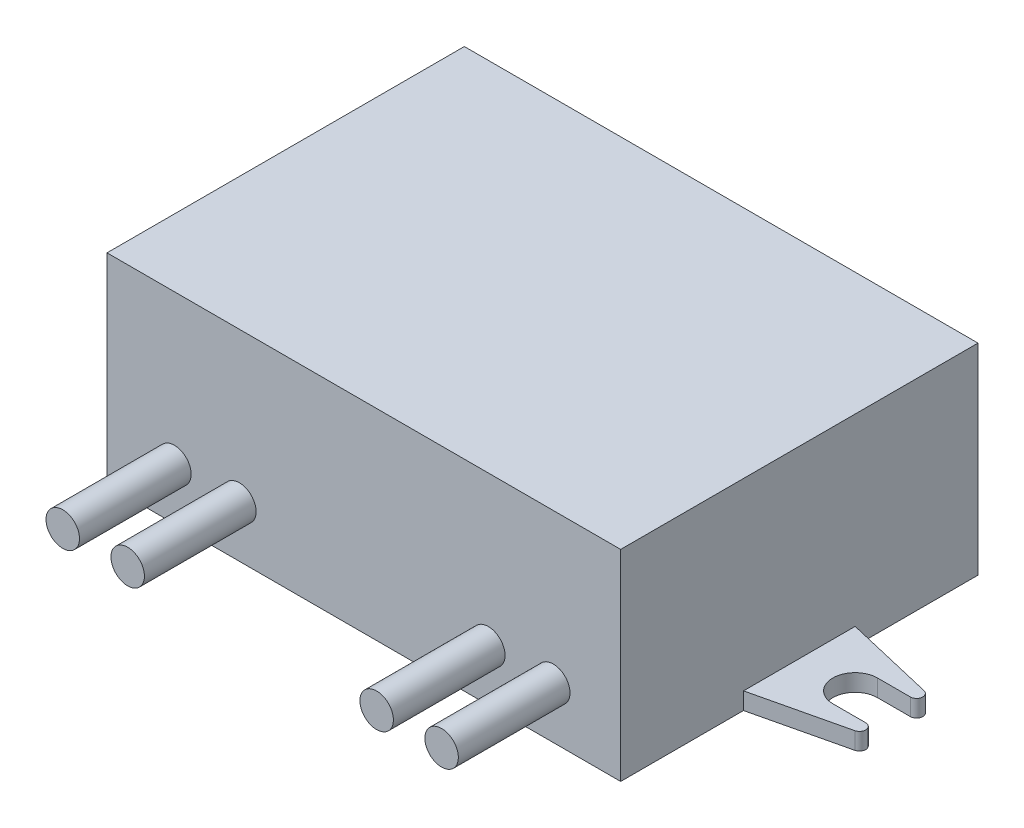
ISO-10303-21;
HEADER;
FILE_DESCRIPTION(('STEP AP214'),'2;1');
FILE_NAME('part.step','',(''),(''),'','','');
FILE_SCHEMA(('AUTOMOTIVE_DESIGN { 1 0 10303 214 1 1 1 1 }'));
ENDSEC;
DATA;
#1=APPLICATION_CONTEXT('core data for automotive mechanical design processes');
#2=APPLICATION_PROTOCOL_DEFINITION('international standard','automotive_design',2000,#1);
#3=PRODUCT_CONTEXT('',#1,'mechanical');
#4=PRODUCT('Part','Part','',(#3));
#5=PRODUCT_RELATED_PRODUCT_CATEGORY('part','',(#4));
#6=PRODUCT_DEFINITION_FORMATION('','',#4);
#7=PRODUCT_DEFINITION_CONTEXT('part definition',#1,'design');
#8=PRODUCT_DEFINITION('design','',#6,#7);
#9=PRODUCT_DEFINITION_SHAPE('','',#8);
#10=(LENGTH_UNIT() NAMED_UNIT(*) SI_UNIT(.MILLI.,.METRE.));
#11=(NAMED_UNIT(*) PLANE_ANGLE_UNIT() SI_UNIT($,.RADIAN.));
#12=(NAMED_UNIT(*) SI_UNIT($,.STERADIAN.) SOLID_ANGLE_UNIT());
#13=UNCERTAINTY_MEASURE_WITH_UNIT(LENGTH_MEASURE(1.E-05),#10,'distance_accuracy_value','');
#14=(GEOMETRIC_REPRESENTATION_CONTEXT(3) GLOBAL_UNCERTAINTY_ASSIGNED_CONTEXT((#13)) GLOBAL_UNIT_ASSIGNED_CONTEXT((#10,
#11,#12)) REPRESENTATION_CONTEXT('',''));
#15=CARTESIAN_POINT('',(0.,0.,0.));
#16=DIRECTION('',(0.,0.,1.));
#17=DIRECTION('',(1.,0.,0.));
#18=AXIS2_PLACEMENT_3D('',#15,#16,#17);
#19=CARTESIAN_POINT('',(30.9419688504284,0.,2.55803114957162));
#20=DIRECTION('',(0.,1.,0.));
#21=DIRECTION('',(-1.,0.,0.));
#22=AXIS2_PLACEMENT_3D('',#19,#20,#21);
#23=CYLINDRICAL_SURFACE('',#22,0.558031149571622);
#24=DIRECTION('',(0.,-1.,0.));
#25=VECTOR('',#24,1.);
#26=CARTESIAN_POINT('',(31.0697799331244,0.,3.10122825102956));
#27=LINE('',#26,#25);
#28=CARTESIAN_POINT('',(31.0697799331244,0.,3.10122825102956));
#29=VERTEX_POINT('',#28);
#30=CARTESIAN_POINT('',(31.0697799331244,1.52802024933194,3.10122825102956));
#31=VERTEX_POINT('',#30);
#32=EDGE_CURVE('E291',#29,#31,#27,.F.);
#33=ORIENTED_EDGE('',*,*,#32,.F.);
#34=CARTESIAN_POINT('',(30.9419688504284,0.,2.55803114957162));
#35=DIRECTION('',(0.,1.,0.));
#36=DIRECTION('',(0.,0.,1.));
#37=AXIS2_PLACEMENT_3D('',#34,#35,#36);
#38=CIRCLE('',#37,0.558031149571622);
#39=CARTESIAN_POINT('',(30.9419688504284,0.,2.));
#40=VERTEX_POINT('',#39);
#41=EDGE_CURVE('E73',#40,#29,#38,.F.);
#42=ORIENTED_EDGE('',*,*,#41,.F.);
#43=DIRECTION('',(0.,-1.,0.));
#44=VECTOR('',#43,1.);
#45=CARTESIAN_POINT('',(30.9419688504284,0.,2.));
#46=LINE('',#45,#44);
#47=CARTESIAN_POINT('',(30.9419688504284,1.52802024933194,2.));
#48=VERTEX_POINT('',#47);
#49=EDGE_CURVE('E295',#48,#40,#46,.T.);
#50=ORIENTED_EDGE('',*,*,#49,.F.);
#51=CARTESIAN_POINT('',(30.9419688504284,1.52802024933196,2.55803114957162));
#52=DIRECTION('',(0.,1.,0.));
#53=DIRECTION('',(-1.,0.,0.));
#54=AXIS2_PLACEMENT_3D('',#51,#52,#53);
#55=CIRCLE('',#54,0.558031149571622);
#56=EDGE_CURVE('E81',#31,#48,#55,.T.);
#57=ORIENTED_EDGE('',*,*,#56,.F.);
#58=EDGE_LOOP('',(#33,#42,#50,#57));
#59=FACE_BOUND('',#58,.T.);
#60=ADVANCED_FACE('F57',(#59),#23,.T.);
#61=CARTESIAN_POINT('',(30.9419688504284,0.,-2.55803114957162));
#62=DIRECTION('',(0.,1.,0.));
#63=DIRECTION('',(-1.,0.,0.));
#64=AXIS2_PLACEMENT_3D('',#61,#62,#63);
#65=CYLINDRICAL_SURFACE('',#64,0.558031149571622);
#66=DIRECTION('',(0.,1.,0.));
#67=VECTOR('',#66,1.);
#68=CARTESIAN_POINT('',(30.9419688504284,0.,-2.));
#69=LINE('',#68,#67);
#70=CARTESIAN_POINT('',(30.9419688504284,0.,-2.));
#71=VERTEX_POINT('',#70);
#72=CARTESIAN_POINT('',(30.9419688504284,1.52802024933194,-2.));
#73=VERTEX_POINT('',#72);
#74=EDGE_CURVE('E277',#71,#73,#69,.T.);
#75=ORIENTED_EDGE('',*,*,#74,.F.);
#76=CARTESIAN_POINT('',(30.9419688504284,0.,-2.55803114957162));
#77=DIRECTION('',(0.,1.,0.));
#78=DIRECTION('',(0.,0.,1.));
#79=AXIS2_PLACEMENT_3D('',#76,#77,#78);
#80=CIRCLE('',#79,0.558031149571622);
#81=CARTESIAN_POINT('',(31.0697799331244,0.,-3.10122825102956));
#82=VERTEX_POINT('',#81);
#83=EDGE_CURVE('E285',#82,#71,#80,.F.);
#84=ORIENTED_EDGE('',*,*,#83,.F.);
#85=DIRECTION('',(0.,1.,0.));
#86=VECTOR('',#85,1.);
#87=CARTESIAN_POINT('',(31.0697799331244,0.,-3.10122825102956));
#88=LINE('',#87,#86);
#89=CARTESIAN_POINT('',(31.0697799331244,1.52802024933194,-3.10122825102956));
#90=VERTEX_POINT('',#89);
#91=EDGE_CURVE('E281',#90,#82,#88,.F.);
#92=ORIENTED_EDGE('',*,*,#91,.F.);
#93=CARTESIAN_POINT('',(30.9419688504284,1.52802024933196,-2.55803114957162));
#94=DIRECTION('',(0.,1.,0.));
#95=DIRECTION('',(-1.,0.,0.));
#96=AXIS2_PLACEMENT_3D('',#93,#94,#95);
#97=CIRCLE('',#96,0.558031149571622);
#98=EDGE_CURVE('E288',#73,#90,#97,.T.);
#99=ORIENTED_EDGE('',*,*,#98,.F.);
#100=EDGE_LOOP('',(#75,#84,#92,#99));
#101=FACE_BOUND('',#100,.T.);
#102=ADVANCED_FACE('F494',(#101),#65,.T.);
#103=CARTESIAN_POINT('',(0.,0.,0.));
#104=DIRECTION('',(0.,1.,0.));
#105=DIRECTION('',(0.,0.,1.));
#106=AXIS2_PLACEMENT_3D('',#103,#104,#105);
#107=PLANE('',#106);
#108=DIRECTION('',(1.,0.,0.));
#109=VECTOR('',#108,1.);
#110=CARTESIAN_POINT('',(0.,0.,2.00000000000001));
#111=LINE('',#110,#109);
#112=CARTESIAN_POINT('',(28.,0.,2.));
#113=VERTEX_POINT('',#112);
#114=EDGE_CURVE('E351',#113,#40,#111,.T.);
#115=ORIENTED_EDGE('',*,*,#114,.T.);
#116=ORIENTED_EDGE('',*,*,#41,.T.);
#117=DIRECTION('',(-0.973417168333576,0.,0.229039333725547));
#118=VECTOR('',#117,1.);
#119=CARTESIAN_POINT('',(2.32131147540983,0.,9.8655737704918));
#120=LINE('',#119,#118);
#121=CARTESIAN_POINT('',(23.,0.,5.));
#122=VERTEX_POINT('',#121);
#123=EDGE_CURVE('E335',#29,#122,#120,.T.);
#124=ORIENTED_EDGE('',*,*,#123,.T.);
#125=DIRECTION('',(0.,0.,-1.));
#126=VECTOR('',#125,1.);
#127=CARTESIAN_POINT('',(23.,0.,0.));
#128=LINE('',#127,#126);
#129=CARTESIAN_POINT('',(23.,0.,16.));
#130=VERTEX_POINT('',#129);
#131=EDGE_CURVE('E333',#130,#122,#128,.T.);
#132=ORIENTED_EDGE('',*,*,#131,.F.);
#133=DIRECTION('',(1.,0.,0.));
#134=VECTOR('',#133,1.);
#135=CARTESIAN_POINT('',(23.,0.,16.));
#136=LINE('',#135,#134);
#137=CARTESIAN_POINT('',(-23.,0.,16.));
#138=VERTEX_POINT('',#137);
#139=EDGE_CURVE('E230',#138,#130,#136,.T.);
#140=ORIENTED_EDGE('',*,*,#139,.F.);
#141=DIRECTION('',(0.,0.,-1.));
#142=VECTOR('',#141,1.);
#143=CARTESIAN_POINT('',(-23.,0.,0.));
#144=LINE('',#143,#142);
#145=CARTESIAN_POINT('',(-23.,0.,5.));
#146=VERTEX_POINT('',#145);
#147=EDGE_CURVE('E331',#138,#146,#144,.T.);
#148=ORIENTED_EDGE('',*,*,#147,.T.);
#149=DIRECTION('',(0.973417168333576,0.,0.229039333725547));
#150=VECTOR('',#149,1.);
#151=CARTESIAN_POINT('',(-2.32131147540983,0.,9.8655737704918));
#152=LINE('',#151,#150);
#153=CARTESIAN_POINT('',(-31.0697799331244,0.,3.10122825102956));
#154=VERTEX_POINT('',#153);
#155=EDGE_CURVE('E393',#154,#146,#152,.T.);
#156=ORIENTED_EDGE('',*,*,#155,.F.);
#157=CARTESIAN_POINT('',(-30.9419688504284,0.,2.55803114957162));
#158=DIRECTION('',(0.,1.,0.));
#159=DIRECTION('',(0.,0.,1.));
#160=AXIS2_PLACEMENT_3D('',#157,#158,#159);
#161=CIRCLE('',#160,0.558031149571623);
#162=CARTESIAN_POINT('',(-30.9419688504284,0.,2.));
#163=VERTEX_POINT('',#162);
#164=EDGE_CURVE('E274',#154,#163,#161,.F.);
#165=ORIENTED_EDGE('',*,*,#164,.T.);
#166=DIRECTION('',(-1.,0.,0.));
#167=VECTOR('',#166,1.);
#168=CARTESIAN_POINT('',(0.,0.,2.00000000000001));
#169=LINE('',#168,#167);
#170=CARTESIAN_POINT('',(-28.,0.,2.));
#171=VERTEX_POINT('',#170);
#172=EDGE_CURVE('E405',#171,#163,#169,.T.);
#173=ORIENTED_EDGE('',*,*,#172,.F.);
#174=CARTESIAN_POINT('',(-28.,0.,0.));
#175=DIRECTION('',(0.,1.,0.));
#176=DIRECTION('',(-1.,0.,0.));
#177=AXIS2_PLACEMENT_3D('',#174,#175,#176);
#178=CIRCLE('',#177,2.);
#179=CARTESIAN_POINT('',(-28.,0.,-2.));
#180=VERTEX_POINT('',#179);
#181=EDGE_CURVE('E409',#171,#180,#178,.T.);
#182=ORIENTED_EDGE('',*,*,#181,.T.);
#183=DIRECTION('',(-1.,0.,0.));
#184=VECTOR('',#183,1.);
#185=CARTESIAN_POINT('',(0.,0.,-2.00000000000001));
#186=LINE('',#185,#184);
#187=CARTESIAN_POINT('',(-30.9419688504284,0.,-2.));
#188=VERTEX_POINT('',#187);
#189=EDGE_CURVE('E414',#180,#188,#186,.T.);
#190=ORIENTED_EDGE('',*,*,#189,.T.);
#191=CARTESIAN_POINT('',(-30.9419688504284,0.,-2.55803114957162));
#192=DIRECTION('',(0.,1.,0.));
#193=DIRECTION('',(0.,0.,1.));
#194=AXIS2_PLACEMENT_3D('',#191,#192,#193);
#195=CIRCLE('',#194,0.558031149571622);
#196=CARTESIAN_POINT('',(-31.0697799331244,0.,-3.10122825102956));
#197=VERTEX_POINT('',#196);
#198=EDGE_CURVE('E260',#188,#197,#195,.F.);
#199=ORIENTED_EDGE('',*,*,#198,.T.);
#200=DIRECTION('',(0.973417168333576,0.,-0.229039333725547));
#201=VECTOR('',#200,1.);
#202=CARTESIAN_POINT('',(-2.32131147540983,0.,-9.86557377049179));
#203=LINE('',#202,#201);
#204=CARTESIAN_POINT('',(-23.,0.,-4.99999999999999));
#205=VERTEX_POINT('',#204);
#206=EDGE_CURVE('E379',#197,#205,#203,.T.);
#207=ORIENTED_EDGE('',*,*,#206,.T.);
#208=DIRECTION('',(0.,0.,-1.));
#209=VECTOR('',#208,1.);
#210=CARTESIAN_POINT('',(-23.,0.,0.));
#211=LINE('',#210,#209);
#212=CARTESIAN_POINT('',(-23.,0.,-16.));
#213=VERTEX_POINT('',#212);
#214=EDGE_CURVE('E227',#205,#213,#211,.T.);
#215=ORIENTED_EDGE('',*,*,#214,.T.);
#216=DIRECTION('',(-1.,0.,0.));
#217=VECTOR('',#216,1.);
#218=CARTESIAN_POINT('',(23.,0.,-16.));
#219=LINE('',#218,#217);
#220=CARTESIAN_POINT('',(23.,0.,-16.));
#221=VERTEX_POINT('',#220);
#222=EDGE_CURVE('E201',#221,#213,#219,.T.);
#223=ORIENTED_EDGE('',*,*,#222,.F.);
#224=DIRECTION('',(0.,0.,-1.));
#225=VECTOR('',#224,1.);
#226=CARTESIAN_POINT('',(23.,0.,0.));
#227=LINE('',#226,#225);
#228=CARTESIAN_POINT('',(23.,0.,-4.99999999999999));
#229=VERTEX_POINT('',#228);
#230=EDGE_CURVE('E212',#229,#221,#227,.T.);
#231=ORIENTED_EDGE('',*,*,#230,.F.);
#232=DIRECTION('',(-0.973417168333576,0.,-0.229039333725547));
#233=VECTOR('',#232,1.);
#234=CARTESIAN_POINT('',(2.32131147540983,0.,-9.86557377049179));
#235=LINE('',#234,#233);
#236=EDGE_CURVE('E220',#82,#229,#235,.T.);
#237=ORIENTED_EDGE('',*,*,#236,.F.);
#238=ORIENTED_EDGE('',*,*,#83,.T.);
#239=DIRECTION('',(1.,0.,0.));
#240=VECTOR('',#239,1.);
#241=CARTESIAN_POINT('',(0.,0.,-2.00000000000001));
#242=LINE('',#241,#240);
#243=CARTESIAN_POINT('',(28.,0.,-2.));
#244=VERTEX_POINT('',#243);
#245=EDGE_CURVE('E354',#244,#71,#242,.T.);
#246=ORIENTED_EDGE('',*,*,#245,.F.);
#247=CARTESIAN_POINT('',(28.,0.,0.));
#248=DIRECTION('',(0.,-1.,0.));
#249=DIRECTION('',(1.,0.,0.));
#250=AXIS2_PLACEMENT_3D('',#247,#248,#249);
#251=CIRCLE('',#250,2.);
#252=EDGE_CURVE('E359',#113,#244,#251,.T.);
#253=ORIENTED_EDGE('',*,*,#252,.F.);
#254=EDGE_LOOP('',(#115,#116,#124,#132,#140,#148,#156,#165,#173,#182,#190,#199,#207,#215,#223,
#231,#237,#238,#246,#253));
#255=FACE_BOUND('',#254,.T.);
#256=ADVANCED_FACE('F225',(#255),#107,.F.);
#257=CARTESIAN_POINT('',(23.,18.,16.));
#258=DIRECTION('',(0.,0.,-1.));
#259=DIRECTION('',(-1.,0.,0.));
#260=AXIS2_PLACEMENT_3D('',#257,#258,#259);
#261=PLANE('',#260);
#262=CARTESIAN_POINT('',(16.9636493228795,4.59385731873266,16.));
#263=DIRECTION('',(0.,0.,-1.));
#264=DIRECTION('',(-1.,0.,0.));
#265=AXIS2_PLACEMENT_3D('',#262,#263,#264);
#266=CIRCLE('',#265,1.5);
#267=CARTESIAN_POINT('',(15.4636493228796,4.59385731873266,16.));
#268=VERTEX_POINT('',#267);
#269=EDGE_CURVE('E12',#268,#268,#266,.F.);
#270=ORIENTED_EDGE('',*,*,#269,.F.);
#271=EDGE_LOOP('',(#270));
#272=FACE_BOUND('',#271,.T.);
#273=CARTESIAN_POINT('',(11.1475409836066,4.59385731873267,16.));
#274=DIRECTION('',(0.,0.,-1.));
#275=DIRECTION('',(-1.,0.,0.));
#276=AXIS2_PLACEMENT_3D('',#273,#274,#275);
#277=CIRCLE('',#276,1.5);
#278=CARTESIAN_POINT('',(9.64754098360656,4.59385731873267,16.));
#279=VERTEX_POINT('',#278);
#280=EDGE_CURVE('E66',#279,#279,#277,.F.);
#281=ORIENTED_EDGE('',*,*,#280,.F.);
#282=EDGE_LOOP('',(#281));
#283=FACE_BOUND('',#282,.T.);
#284=CARTESIAN_POINT('',(-11.1475409836066,4.59385731873267,16.));
#285=DIRECTION('',(0.,0.,-1.));
#286=DIRECTION('',(-1.,0.,0.));
#287=AXIS2_PLACEMENT_3D('',#284,#285,#286);
#288=CIRCLE('',#287,1.5);
#289=CARTESIAN_POINT('',(-12.6475409836066,4.59385731873267,16.));
#290=VERTEX_POINT('',#289);
#291=EDGE_CURVE('E306',#290,#290,#288,.F.);
#292=ORIENTED_EDGE('',*,*,#291,.F.);
#293=EDGE_LOOP('',(#292));
#294=FACE_BOUND('',#293,.T.);
#295=CARTESIAN_POINT('',(-16.9636493228795,4.59385731873267,16.));
#296=DIRECTION('',(0.,0.,-1.));
#297=DIRECTION('',(-1.,0.,0.));
#298=AXIS2_PLACEMENT_3D('',#295,#296,#297);
#299=CIRCLE('',#298,1.5);
#300=CARTESIAN_POINT('',(-18.4636493228795,4.59385731873267,16.));
#301=VERTEX_POINT('',#300);
#302=EDGE_CURVE('E302',#301,#301,#299,.F.);
#303=ORIENTED_EDGE('',*,*,#302,.F.);
#304=EDGE_LOOP('',(#303));
#305=FACE_BOUND('',#304,.T.);
#306=ORIENTED_EDGE('',*,*,#139,.T.);
#307=DIRECTION('',(0.,-1.,0.));
#308=VECTOR('',#307,1.);
#309=CARTESIAN_POINT('',(23.,18.,16.));
#310=LINE('',#309,#308);
#311=CARTESIAN_POINT('',(23.,18.,16.));
#312=VERTEX_POINT('',#311);
#313=EDGE_CURVE('E207',#312,#130,#310,.T.);
#314=ORIENTED_EDGE('',*,*,#313,.F.);
#315=DIRECTION('',(1.,0.,0.));
#316=VECTOR('',#315,1.);
#317=CARTESIAN_POINT('',(23.,18.,16.));
#318=LINE('',#317,#316);
#319=CARTESIAN_POINT('',(-23.,18.,16.));
#320=VERTEX_POINT('',#319);
#321=EDGE_CURVE('E235',#320,#312,#318,.T.);
#322=ORIENTED_EDGE('',*,*,#321,.F.);
#323=DIRECTION('',(0.,-1.,0.));
#324=VECTOR('',#323,1.);
#325=CARTESIAN_POINT('',(-23.,18.,16.));
#326=LINE('',#325,#324);
#327=EDGE_CURVE('E246',#320,#138,#326,.T.);
#328=ORIENTED_EDGE('',*,*,#327,.T.);
#329=EDGE_LOOP('',(#306,#314,#322,#328));
#330=FACE_BOUND('',#329,.T.);
#331=ADVANCED_FACE('F315',(#272,#283,#294,#305,#330),#261,.F.);
#332=CARTESIAN_POINT('',(23.,18.,-16.));
#333=DIRECTION('',(0.,0.,1.));
#334=DIRECTION('',(1.,0.,0.));
#335=AXIS2_PLACEMENT_3D('',#332,#333,#334);
#336=PLANE('',#335);
#337=DIRECTION('',(0.,-1.,0.));
#338=VECTOR('',#337,1.);
#339=CARTESIAN_POINT('',(23.,18.,-16.));
#340=LINE('',#339,#338);
#341=CARTESIAN_POINT('',(23.,18.,-16.));
#342=VERTEX_POINT('',#341);
#343=EDGE_CURVE('E196',#342,#221,#340,.T.);
#344=ORIENTED_EDGE('',*,*,#343,.T.);
#345=ORIENTED_EDGE('',*,*,#222,.T.);
#346=DIRECTION('',(0.,-1.,0.));
#347=VECTOR('',#346,1.);
#348=CARTESIAN_POINT('',(-23.,18.,-16.));
#349=LINE('',#348,#347);
#350=CARTESIAN_POINT('',(-23.,18.,-16.));
#351=VERTEX_POINT('',#350);
#352=EDGE_CURVE('E208',#351,#213,#349,.T.);
#353=ORIENTED_EDGE('',*,*,#352,.F.);
#354=DIRECTION('',(-1.,0.,0.));
#355=VECTOR('',#354,1.);
#356=CARTESIAN_POINT('',(23.,18.,-16.));
#357=LINE('',#356,#355);
#358=EDGE_CURVE('E203',#342,#351,#357,.T.);
#359=ORIENTED_EDGE('',*,*,#358,.F.);
#360=EDGE_LOOP('',(#344,#345,#353,#359));
#361=FACE_BOUND('',#360,.T.);
#362=ADVANCED_FACE('F198',(#361),#336,.F.);
#363=CARTESIAN_POINT('',(31.5,1.52802024933196,-16.));
#364=DIRECTION('',(0.,1.,0.));
#365=DIRECTION('',(-1.,0.,0.));
#366=AXIS2_PLACEMENT_3D('',#363,#364,#365);
#367=PLANE('',#366);
#368=DIRECTION('',(-0.973417168333576,0.,0.229039333725547));
#369=VECTOR('',#368,1.);
#370=CARTESIAN_POINT('',(2.32131147540983,1.52802024933195,9.8655737704918));
#371=LINE('',#370,#369);
#372=CARTESIAN_POINT('',(23.,1.52802024933196,5.));
#373=VERTEX_POINT('',#372);
#374=EDGE_CURVE('E344',#31,#373,#371,.T.);
#375=ORIENTED_EDGE('',*,*,#374,.F.);
#376=ORIENTED_EDGE('',*,*,#56,.T.);
#377=DIRECTION('',(1.,0.,0.));
#378=VECTOR('',#377,1.);
#379=CARTESIAN_POINT('',(0.,1.52802024933195,2.00000000000001));
#380=LINE('',#379,#378);
#381=CARTESIAN_POINT('',(28.,1.52802024933194,2.));
#382=VERTEX_POINT('',#381);
#383=EDGE_CURVE('E363',#382,#48,#380,.T.);
#384=ORIENTED_EDGE('',*,*,#383,.F.);
#385=CARTESIAN_POINT('',(28.,1.52802024933194,0.));
#386=DIRECTION('',(0.,-1.,0.));
#387=DIRECTION('',(1.,0.,0.));
#388=AXIS2_PLACEMENT_3D('',#385,#386,#387);
#389=CIRCLE('',#388,2.);
#390=CARTESIAN_POINT('',(28.,1.52802024933194,-2.));
#391=VERTEX_POINT('',#390);
#392=EDGE_CURVE('E355',#382,#391,#389,.T.);
#393=ORIENTED_EDGE('',*,*,#392,.T.);
#394=DIRECTION('',(1.,0.,0.));
#395=VECTOR('',#394,1.);
#396=CARTESIAN_POINT('',(0.,1.52802024933195,-2.00000000000001));
#397=LINE('',#396,#395);
#398=EDGE_CURVE('E367',#391,#73,#397,.T.);
#399=ORIENTED_EDGE('',*,*,#398,.T.);
#400=ORIENTED_EDGE('',*,*,#98,.T.);
#401=DIRECTION('',(-0.973417168333576,0.,-0.229039333725547));
#402=VECTOR('',#401,1.);
#403=CARTESIAN_POINT('',(2.32131147540983,1.52802024933195,-9.86557377049179));
#404=LINE('',#403,#402);
#405=CARTESIAN_POINT('',(23.,1.52802024933194,-4.99999999999999));
#406=VERTEX_POINT('',#405);
#407=EDGE_CURVE('E221',#90,#406,#404,.T.);
#408=ORIENTED_EDGE('',*,*,#407,.T.);
#409=DIRECTION('',(0.,0.,-1.));
#410=VECTOR('',#409,1.);
#411=CARTESIAN_POINT('',(23.,1.52802024933196,16.));
#412=LINE('',#411,#410);
#413=EDGE_CURVE('E392',#373,#406,#412,.T.);
#414=ORIENTED_EDGE('',*,*,#413,.F.);
#415=EDGE_LOOP('',(#375,#376,#384,#393,#399,#400,#408,#414));
#416=FACE_BOUND('',#415,.T.);
#417=ADVANCED_FACE('F483',(#416),#367,.T.);
#418=CARTESIAN_POINT('',(-30.9419688504284,1.52802024933194,2.55803114957162));
#419=DIRECTION('',(0.,1.,0.));
#420=DIRECTION('',(-1.,0.,0.));
#421=AXIS2_PLACEMENT_3D('',#418,#419,#420);
#422=CYLINDRICAL_SURFACE('',#421,0.558031149571623);
#423=DIRECTION('',(0.,1.,0.));
#424=VECTOR('',#423,1.);
#425=CARTESIAN_POINT('',(-31.0697799331244,0.,3.10122825102956));
#426=LINE('',#425,#424);
#427=CARTESIAN_POINT('',(-31.0697799331244,1.52802024933194,3.10122825102956));
#428=VERTEX_POINT('',#427);
#429=EDGE_CURVE('E263',#428,#154,#426,.F.);
#430=ORIENTED_EDGE('',*,*,#429,.F.);
#431=CARTESIAN_POINT('',(-30.9419688504284,1.52802024933194,2.55803114957162));
#432=DIRECTION('',(0.,1.,0.));
#433=DIRECTION('',(-1.,0.,0.));
#434=AXIS2_PLACEMENT_3D('',#431,#432,#433);
#435=CIRCLE('',#434,0.558031149571623);
#436=CARTESIAN_POINT('',(-30.9419688504284,1.52802024933194,2.));
#437=VERTEX_POINT('',#436);
#438=EDGE_CURVE('E271',#437,#428,#435,.T.);
#439=ORIENTED_EDGE('',*,*,#438,.F.);
#440=DIRECTION('',(0.,1.,0.));
#441=VECTOR('',#440,1.);
#442=CARTESIAN_POINT('',(-30.9419688504284,0.,2.));
#443=LINE('',#442,#441);
#444=EDGE_CURVE('E267',#163,#437,#443,.T.);
#445=ORIENTED_EDGE('',*,*,#444,.F.);
#446=ORIENTED_EDGE('',*,*,#164,.F.);
#447=EDGE_LOOP('',(#430,#439,#445,#446));
#448=FACE_BOUND('',#447,.T.);
#449=ADVANCED_FACE('F458',(#448),#422,.T.);
#450=CARTESIAN_POINT('',(-30.9419688504284,1.52802024933194,-2.55803114957162));
#451=DIRECTION('',(0.,1.,0.));
#452=DIRECTION('',(-1.,0.,0.));
#453=AXIS2_PLACEMENT_3D('',#450,#451,#452);
#454=CYLINDRICAL_SURFACE('',#453,0.558031149571622);
#455=DIRECTION('',(0.,-1.,0.));
#456=VECTOR('',#455,1.);
#457=CARTESIAN_POINT('',(-30.9419688504284,1.52802024933194,-2.));
#458=LINE('',#457,#456);
#459=CARTESIAN_POINT('',(-30.9419688504284,1.52802024933194,-2.));
#460=VERTEX_POINT('',#459);
#461=EDGE_CURVE('E249',#460,#188,#458,.T.);
#462=ORIENTED_EDGE('',*,*,#461,.F.);
#463=CARTESIAN_POINT('',(-30.9419688504284,1.52802024933194,-2.55803114957162));
#464=DIRECTION('',(0.,1.,0.));
#465=DIRECTION('',(-1.,0.,0.));
#466=AXIS2_PLACEMENT_3D('',#463,#464,#465);
#467=CIRCLE('',#466,0.558031149571622);
#468=CARTESIAN_POINT('',(-31.0697799331244,1.52802024933194,-3.10122825102956));
#469=VERTEX_POINT('',#468);
#470=EDGE_CURVE('E257',#469,#460,#467,.T.);
#471=ORIENTED_EDGE('',*,*,#470,.F.);
#472=DIRECTION('',(0.,-1.,0.));
#473=VECTOR('',#472,1.);
#474=CARTESIAN_POINT('',(-31.0697799331244,1.52802024933194,-3.10122825102956));
#475=LINE('',#474,#473);
#476=EDGE_CURVE('E253',#197,#469,#475,.F.);
#477=ORIENTED_EDGE('',*,*,#476,.F.);
#478=ORIENTED_EDGE('',*,*,#198,.F.);
#479=EDGE_LOOP('',(#462,#471,#477,#478));
#480=FACE_BOUND('',#479,.T.);
#481=ADVANCED_FACE('F473',(#480),#454,.T.);
#482=DIRECTION('',(-1.,0.,0.));
#483=VECTOR('',#482,1.);
#484=CARTESIAN_POINT('',(0.,1.52802024933195,2.00000000000001));
#485=LINE('',#484,#483);
#486=CARTESIAN_POINT('',(-28.,1.52802024933194,2.));
#487=VERTEX_POINT('',#486);
#488=EDGE_CURVE('E419',#487,#437,#485,.T.);
#489=ORIENTED_EDGE('',*,*,#488,.T.);
#490=ORIENTED_EDGE('',*,*,#438,.T.);
#491=DIRECTION('',(0.973417168333576,0.,0.229039333725547));
#492=VECTOR('',#491,1.);
#493=CARTESIAN_POINT('',(-2.32131147540983,1.52802024933195,9.8655737704918));
#494=LINE('',#493,#492);
#495=CARTESIAN_POINT('',(-23.,1.52802024933194,5.));
#496=VERTEX_POINT('',#495);
#497=EDGE_CURVE('E396',#428,#496,#494,.T.);
#498=ORIENTED_EDGE('',*,*,#497,.T.);
#499=DIRECTION('',(0.,0.,1.));
#500=VECTOR('',#499,1.);
#501=CARTESIAN_POINT('',(-23.,1.52802024933194,16.));
#502=LINE('',#501,#500);
#503=CARTESIAN_POINT('',(-23.,1.52802024933194,-4.99999999999999));
#504=VERTEX_POINT('',#503);
#505=EDGE_CURVE('E238',#504,#496,#502,.T.);
#506=ORIENTED_EDGE('',*,*,#505,.F.);
#507=DIRECTION('',(0.973417168333576,0.,-0.229039333725547));
#508=VECTOR('',#507,1.);
#509=CARTESIAN_POINT('',(-2.32131147540983,1.52802024933195,-9.86557377049179));
#510=LINE('',#509,#508);
#511=EDGE_CURVE('E382',#469,#504,#510,.T.);
#512=ORIENTED_EDGE('',*,*,#511,.F.);
#513=ORIENTED_EDGE('',*,*,#470,.T.);
#514=DIRECTION('',(-1.,0.,0.));
#515=VECTOR('',#514,1.);
#516=CARTESIAN_POINT('',(0.,1.52802024933195,-2.00000000000001));
#517=LINE('',#516,#515);
#518=CARTESIAN_POINT('',(-28.,1.52802024933194,-2.));
#519=VERTEX_POINT('',#518);
#520=EDGE_CURVE('E410',#519,#460,#517,.T.);
#521=ORIENTED_EDGE('',*,*,#520,.F.);
#522=CARTESIAN_POINT('',(-28.,1.52802024933194,0.));
#523=DIRECTION('',(0.,1.,0.));
#524=DIRECTION('',(-1.,0.,0.));
#525=AXIS2_PLACEMENT_3D('',#522,#523,#524);
#526=CIRCLE('',#525,2.);
#527=EDGE_CURVE('E423',#487,#519,#526,.T.);
#528=ORIENTED_EDGE('',*,*,#527,.F.);
#529=EDGE_LOOP('',(#489,#490,#498,#506,#512,#513,#521,#528));
#530=FACE_BOUND('',#529,.T.);
#531=ADVANCED_FACE('F480',(#530),#367,.T.);
#532=CARTESIAN_POINT('',(-23.,18.,16.));
#533=DIRECTION('',(1.,0.,0.));
#534=DIRECTION('',(0.,0.,-1.));
#535=AXIS2_PLACEMENT_3D('',#532,#533,#534);
#536=PLANE('',#535);
#537=ORIENTED_EDGE('',*,*,#352,.T.);
#538=ORIENTED_EDGE('',*,*,#214,.F.);
#539=DIRECTION('',(0.,1.,0.));
#540=VECTOR('',#539,1.);
#541=CARTESIAN_POINT('',(-23.,0.,-4.99999999999999));
#542=LINE('',#541,#540);
#543=EDGE_CURVE('E385',#205,#504,#542,.T.);
#544=ORIENTED_EDGE('',*,*,#543,.T.);
#545=ORIENTED_EDGE('',*,*,#505,.T.);
#546=DIRECTION('',(0.,1.,0.));
#547=VECTOR('',#546,1.);
#548=CARTESIAN_POINT('',(-23.,0.,5.));
#549=LINE('',#548,#547);
#550=EDGE_CURVE('E388',#146,#496,#549,.T.);
#551=ORIENTED_EDGE('',*,*,#550,.F.);
#552=ORIENTED_EDGE('',*,*,#147,.F.);
#553=ORIENTED_EDGE('',*,*,#327,.F.);
#554=DIRECTION('',(0.,0.,1.));
#555=VECTOR('',#554,1.);
#556=CARTESIAN_POINT('',(-23.,18.,16.));
#557=LINE('',#556,#555);
#558=EDGE_CURVE('E229',#351,#320,#557,.T.);
#559=ORIENTED_EDGE('',*,*,#558,.F.);
#560=EDGE_LOOP('',(#537,#538,#544,#545,#551,#552,#553,#559));
#561=FACE_BOUND('',#560,.T.);
#562=ADVANCED_FACE('F448',(#561),#536,.F.);
#563=CARTESIAN_POINT('',(23.,18.,16.));
#564=DIRECTION('',(-1.,0.,0.));
#565=DIRECTION('',(0.,0.,1.));
#566=AXIS2_PLACEMENT_3D('',#563,#564,#565);
#567=PLANE('',#566);
#568=ORIENTED_EDGE('',*,*,#313,.T.);
#569=ORIENTED_EDGE('',*,*,#131,.T.);
#570=DIRECTION('',(0.,1.,0.));
#571=VECTOR('',#570,1.);
#572=CARTESIAN_POINT('',(23.,0.,5.));
#573=LINE('',#572,#571);
#574=EDGE_CURVE('E339',#122,#373,#573,.T.);
#575=ORIENTED_EDGE('',*,*,#574,.T.);
#576=ORIENTED_EDGE('',*,*,#413,.T.);
#577=DIRECTION('',(0.,1.,0.));
#578=VECTOR('',#577,1.);
#579=CARTESIAN_POINT('',(23.,0.,-4.99999999999999));
#580=LINE('',#579,#578);
#581=EDGE_CURVE('E216',#229,#406,#580,.T.);
#582=ORIENTED_EDGE('',*,*,#581,.F.);
#583=ORIENTED_EDGE('',*,*,#230,.T.);
#584=ORIENTED_EDGE('',*,*,#343,.F.);
#585=DIRECTION('',(0.,0.,-1.));
#586=VECTOR('',#585,1.);
#587=CARTESIAN_POINT('',(23.,18.,16.));
#588=LINE('',#587,#586);
#589=EDGE_CURVE('E441',#312,#342,#588,.T.);
#590=ORIENTED_EDGE('',*,*,#589,.F.);
#591=EDGE_LOOP('',(#568,#569,#575,#576,#582,#583,#584,#590));
#592=FACE_BOUND('',#591,.T.);
#593=ADVANCED_FACE('F213',(#592),#567,.F.);
#594=CARTESIAN_POINT('',(0.,18.,0.));
#595=DIRECTION('',(0.,1.,0.));
#596=DIRECTION('',(0.,0.,1.));
#597=AXIS2_PLACEMENT_3D('',#594,#595,#596);
#598=PLANE('',#597);
#599=ORIENTED_EDGE('',*,*,#558,.T.);
#600=ORIENTED_EDGE('',*,*,#321,.T.);
#601=ORIENTED_EDGE('',*,*,#589,.T.);
#602=ORIENTED_EDGE('',*,*,#358,.T.);
#603=EDGE_LOOP('',(#599,#600,#601,#602));
#604=FACE_BOUND('',#603,.T.);
#605=ADVANCED_FACE('F445',(#604),#598,.T.);
#606=CARTESIAN_POINT('',(0.,0.,2.00000000000001));
#607=DIRECTION('',(0.,0.,-1.));
#608=DIRECTION('',(-1.,0.,0.));
#609=AXIS2_PLACEMENT_3D('',#606,#607,#608);
#610=PLANE('',#609);
#611=ORIENTED_EDGE('',*,*,#172,.T.);
#612=ORIENTED_EDGE('',*,*,#444,.T.);
#613=ORIENTED_EDGE('',*,*,#488,.F.);
#614=DIRECTION('',(0.,1.,0.));
#615=VECTOR('',#614,1.);
#616=CARTESIAN_POINT('',(-28.,0.,2.));
#617=LINE('',#616,#615);
#618=EDGE_CURVE('E418',#171,#487,#617,.T.);
#619=ORIENTED_EDGE('',*,*,#618,.F.);
#620=EDGE_LOOP('',(#611,#612,#613,#619));
#621=FACE_BOUND('',#620,.T.);
#622=ADVANCED_FACE('F461',(#621),#610,.T.);
#623=CARTESIAN_POINT('',(0.,0.,-2.00000000000001));
#624=DIRECTION('',(0.,0.,-1.));
#625=DIRECTION('',(-1.,0.,0.));
#626=AXIS2_PLACEMENT_3D('',#623,#624,#625);
#627=PLANE('',#626);
#628=ORIENTED_EDGE('',*,*,#520,.T.);
#629=ORIENTED_EDGE('',*,*,#461,.T.);
#630=ORIENTED_EDGE('',*,*,#189,.F.);
#631=DIRECTION('',(0.,1.,0.));
#632=VECTOR('',#631,1.);
#633=CARTESIAN_POINT('',(-28.,0.,-2.));
#634=LINE('',#633,#632);
#635=EDGE_CURVE('E401',#180,#519,#634,.T.);
#636=ORIENTED_EDGE('',*,*,#635,.T.);
#637=EDGE_LOOP('',(#628,#629,#630,#636));
#638=FACE_BOUND('',#637,.T.);
#639=ADVANCED_FACE('F469',(#638),#627,.F.);
#640=CARTESIAN_POINT('',(-28.,0.,0.));
#641=DIRECTION('',(0.,1.,0.));
#642=DIRECTION('',(-1.,0.,0.));
#643=AXIS2_PLACEMENT_3D('',#640,#641,#642);
#644=CYLINDRICAL_SURFACE('',#643,2.);
#645=ORIENTED_EDGE('',*,*,#527,.T.);
#646=ORIENTED_EDGE('',*,*,#635,.F.);
#647=ORIENTED_EDGE('',*,*,#181,.F.);
#648=ORIENTED_EDGE('',*,*,#618,.T.);
#649=EDGE_LOOP('',(#645,#646,#647,#648));
#650=FACE_BOUND('',#649,.T.);
#651=ADVANCED_FACE('F465',(#650),#644,.F.);
#652=CARTESIAN_POINT('',(-2.32131147540983,0.,9.8655737704918));
#653=DIRECTION('',(-0.229039333725547,0.,0.973417168333576));
#654=DIRECTION('',(0.973417168333576,0.,0.229039333725547));
#655=AXIS2_PLACEMENT_3D('',#652,#653,#654);
#656=PLANE('',#655);
#657=ORIENTED_EDGE('',*,*,#497,.F.);
#658=ORIENTED_EDGE('',*,*,#429,.T.);
#659=ORIENTED_EDGE('',*,*,#155,.T.);
#660=ORIENTED_EDGE('',*,*,#550,.T.);
#661=EDGE_LOOP('',(#657,#658,#659,#660));
#662=FACE_BOUND('',#661,.T.);
#663=ADVANCED_FACE('F453',(#662),#656,.T.);
#664=CARTESIAN_POINT('',(-2.32131147540983,0.,-9.86557377049179));
#665=DIRECTION('',(0.229039333725547,0.,0.973417168333576));
#666=DIRECTION('',(0.973417168333576,0.,-0.229039333725547));
#667=AXIS2_PLACEMENT_3D('',#664,#665,#666);
#668=PLANE('',#667);
#669=ORIENTED_EDGE('',*,*,#206,.F.);
#670=ORIENTED_EDGE('',*,*,#476,.T.);
#671=ORIENTED_EDGE('',*,*,#511,.T.);
#672=ORIENTED_EDGE('',*,*,#543,.F.);
#673=EDGE_LOOP('',(#669,#670,#671,#672));
#674=FACE_BOUND('',#673,.T.);
#675=ADVANCED_FACE('F478',(#674),#668,.F.);
#676=CARTESIAN_POINT('',(0.,0.,2.00000000000001));
#677=DIRECTION('',(0.,0.,1.));
#678=DIRECTION('',(1.,0.,0.));
#679=AXIS2_PLACEMENT_3D('',#676,#677,#678);
#680=PLANE('',#679);
#681=ORIENTED_EDGE('',*,*,#383,.T.);
#682=ORIENTED_EDGE('',*,*,#49,.T.);
#683=ORIENTED_EDGE('',*,*,#114,.F.);
#684=DIRECTION('',(0.,1.,0.));
#685=VECTOR('',#684,1.);
#686=CARTESIAN_POINT('',(28.,0.,2.));
#687=LINE('',#686,#685);
#688=EDGE_CURVE('E349',#113,#382,#687,.T.);
#689=ORIENTED_EDGE('',*,*,#688,.T.);
#690=EDGE_LOOP('',(#681,#682,#683,#689));
#691=FACE_BOUND('',#690,.T.);
#692=ADVANCED_FACE('F571',(#691),#680,.F.);
#693=CARTESIAN_POINT('',(28.,0.,0.));
#694=DIRECTION('',(0.,1.,0.));
#695=DIRECTION('',(-1.,0.,0.));
#696=AXIS2_PLACEMENT_3D('',#693,#694,#695);
#697=CYLINDRICAL_SURFACE('',#696,2.);
#698=ORIENTED_EDGE('',*,*,#392,.F.);
#699=ORIENTED_EDGE('',*,*,#688,.F.);
#700=ORIENTED_EDGE('',*,*,#252,.T.);
#701=DIRECTION('',(0.,1.,0.));
#702=VECTOR('',#701,1.);
#703=CARTESIAN_POINT('',(28.,0.,-2.));
#704=LINE('',#703,#702);
#705=EDGE_CURVE('E362',#244,#391,#704,.T.);
#706=ORIENTED_EDGE('',*,*,#705,.T.);
#707=EDGE_LOOP('',(#698,#699,#700,#706));
#708=FACE_BOUND('',#707,.T.);
#709=ADVANCED_FACE('F568',(#708),#697,.F.);
#710=CARTESIAN_POINT('',(0.,0.,-2.00000000000001));
#711=DIRECTION('',(0.,0.,1.));
#712=DIRECTION('',(1.,0.,0.));
#713=AXIS2_PLACEMENT_3D('',#710,#711,#712);
#714=PLANE('',#713);
#715=ORIENTED_EDGE('',*,*,#245,.T.);
#716=ORIENTED_EDGE('',*,*,#74,.T.);
#717=ORIENTED_EDGE('',*,*,#398,.F.);
#718=ORIENTED_EDGE('',*,*,#705,.F.);
#719=EDGE_LOOP('',(#715,#716,#717,#718));
#720=FACE_BOUND('',#719,.T.);
#721=ADVANCED_FACE('F567',(#720),#714,.T.);
#722=CARTESIAN_POINT('',(2.32131147540983,0.,9.8655737704918));
#723=DIRECTION('',(-0.229039333725547,0.,-0.973417168333576));
#724=DIRECTION('',(-0.973417168333576,0.,0.229039333725547));
#725=AXIS2_PLACEMENT_3D('',#722,#723,#724);
#726=PLANE('',#725);
#727=ORIENTED_EDGE('',*,*,#123,.F.);
#728=ORIENTED_EDGE('',*,*,#32,.T.);
#729=ORIENTED_EDGE('',*,*,#374,.T.);
#730=ORIENTED_EDGE('',*,*,#574,.F.);
#731=EDGE_LOOP('',(#727,#728,#729,#730));
#732=FACE_BOUND('',#731,.T.);
#733=ADVANCED_FACE('F500',(#732),#726,.F.);
#734=CARTESIAN_POINT('',(2.32131147540983,0.,-9.86557377049179));
#735=DIRECTION('',(0.229039333725547,0.,-0.973417168333576));
#736=DIRECTION('',(-0.973417168333576,0.,-0.229039333725547));
#737=AXIS2_PLACEMENT_3D('',#734,#735,#736);
#738=PLANE('',#737);
#739=ORIENTED_EDGE('',*,*,#407,.F.);
#740=ORIENTED_EDGE('',*,*,#91,.T.);
#741=ORIENTED_EDGE('',*,*,#236,.T.);
#742=ORIENTED_EDGE('',*,*,#581,.T.);
#743=EDGE_LOOP('',(#739,#740,#741,#742));
#744=FACE_BOUND('',#743,.T.);
#745=ADVANCED_FACE('F507',(#744),#738,.T.);
#746=CARTESIAN_POINT('',(-16.9636493228795,4.59385731873267,26.));
#747=DIRECTION('',(0.,0.,-1.));
#748=DIRECTION('',(-1.,0.,0.));
#749=AXIS2_PLACEMENT_3D('',#746,#747,#748);
#750=CYLINDRICAL_SURFACE('',#749,1.5);
#751=CARTESIAN_POINT('',(-16.9636493228795,4.59385731873267,26.));
#752=DIRECTION('',(0.,0.,1.));
#753=DIRECTION('',(1.,0.,0.));
#754=AXIS2_PLACEMENT_3D('',#751,#752,#753);
#755=CIRCLE('',#754,1.5);
#756=CARTESIAN_POINT('',(-15.4636493228795,4.59385731873267,26.));
#757=VERTEX_POINT('',#756);
#758=EDGE_CURVE('E368',#757,#757,#755,.T.);
#759=ORIENTED_EDGE('',*,*,#758,.F.);
#760=EDGE_LOOP('',(#759));
#761=FACE_BOUND('',#760,.T.);
#762=ORIENTED_EDGE('',*,*,#302,.T.);
#763=EDGE_LOOP('',(#762));
#764=FACE_BOUND('',#763,.T.);
#765=ADVANCED_FACE('F558',(#761,#764),#750,.T.);
#766=CARTESIAN_POINT('',(-16.9636493228795,4.59385731873267,26.));
#767=DIRECTION('',(0.,0.,1.));
#768=DIRECTION('',(1.,0.,0.));
#769=AXIS2_PLACEMENT_3D('',#766,#767,#768);
#770=PLANE('',#769);
#771=ORIENTED_EDGE('',*,*,#758,.T.);
#772=EDGE_LOOP('',(#771));
#773=FACE_BOUND('',#772,.T.);
#774=ADVANCED_FACE('F551',(#773),#770,.T.);
#775=CARTESIAN_POINT('',(-11.1475409836066,4.59385731873267,26.));
#776=DIRECTION('',(0.,0.,-1.));
#777=DIRECTION('',(-1.,0.,0.));
#778=AXIS2_PLACEMENT_3D('',#775,#776,#777);
#779=CYLINDRICAL_SURFACE('',#778,1.5);
#780=CARTESIAN_POINT('',(-11.1475409836066,4.59385731873267,26.));
#781=DIRECTION('',(0.,0.,1.));
#782=DIRECTION('',(1.,0.,0.));
#783=AXIS2_PLACEMENT_3D('',#780,#781,#782);
#784=CIRCLE('',#783,1.5);
#785=CARTESIAN_POINT('',(-9.64754098360656,4.59385731873267,26.));
#786=VERTEX_POINT('',#785);
#787=EDGE_CURVE('E515',#786,#786,#784,.T.);
#788=ORIENTED_EDGE('',*,*,#787,.F.);
#789=EDGE_LOOP('',(#788));
#790=FACE_BOUND('',#789,.T.);
#791=ORIENTED_EDGE('',*,*,#291,.T.);
#792=EDGE_LOOP('',(#791));
#793=FACE_BOUND('',#792,.T.);
#794=ADVANCED_FACE('F548',(#790,#793),#779,.T.);
#795=CARTESIAN_POINT('',(-11.1475409836066,4.59385731873267,26.));
#796=DIRECTION('',(0.,0.,1.));
#797=DIRECTION('',(1.,0.,0.));
#798=AXIS2_PLACEMENT_3D('',#795,#796,#797);
#799=PLANE('',#798);
#800=ORIENTED_EDGE('',*,*,#787,.T.);
#801=EDGE_LOOP('',(#800));
#802=FACE_BOUND('',#801,.T.);
#803=ADVANCED_FACE('F545',(#802),#799,.T.);
#804=CARTESIAN_POINT('',(11.1475409836066,4.59385731873267,26.));
#805=DIRECTION('',(0.,0.,-1.));
#806=DIRECTION('',(-1.,0.,0.));
#807=AXIS2_PLACEMENT_3D('',#804,#805,#806);
#808=CYLINDRICAL_SURFACE('',#807,1.5);
#809=CARTESIAN_POINT('',(11.1475409836066,4.59385731873267,26.));
#810=DIRECTION('',(0.,0.,1.));
#811=DIRECTION('',(-1.,0.,0.));
#812=AXIS2_PLACEMENT_3D('',#809,#810,#811);
#813=CIRCLE('',#812,1.5);
#814=CARTESIAN_POINT('',(9.64754098360656,4.59385731873267,26.));
#815=VERTEX_POINT('',#814);
#816=EDGE_CURVE('E519',#815,#815,#813,.T.);
#817=ORIENTED_EDGE('',*,*,#816,.F.);
#818=EDGE_LOOP('',(#817));
#819=FACE_BOUND('',#818,.T.);
#820=ORIENTED_EDGE('',*,*,#280,.T.);
#821=EDGE_LOOP('',(#820));
#822=FACE_BOUND('',#821,.T.);
#823=ADVANCED_FACE('F313',(#819,#822),#808,.T.);
#824=CARTESIAN_POINT('',(11.1475409836066,4.59385731873267,26.));
#825=DIRECTION('',(0.,0.,-1.));
#826=DIRECTION('',(-1.,0.,0.));
#827=AXIS2_PLACEMENT_3D('',#824,#825,#826);
#828=PLANE('',#827);
#829=ORIENTED_EDGE('',*,*,#816,.T.);
#830=EDGE_LOOP('',(#829));
#831=FACE_BOUND('',#830,.T.);
#832=ADVANCED_FACE('F533',(#831),#828,.F.);
#833=CARTESIAN_POINT('',(16.9636493228795,4.59385731873266,26.));
#834=DIRECTION('',(0.,0.,-1.));
#835=DIRECTION('',(-1.,0.,0.));
#836=AXIS2_PLACEMENT_3D('',#833,#834,#835);
#837=CYLINDRICAL_SURFACE('',#836,1.5);
#838=CARTESIAN_POINT('',(16.9636493228795,4.59385731873266,26.));
#839=DIRECTION('',(0.,0.,1.));
#840=DIRECTION('',(-1.,0.,0.));
#841=AXIS2_PLACEMENT_3D('',#838,#839,#840);
#842=CIRCLE('',#841,1.5);
#843=CARTESIAN_POINT('',(15.4636493228796,4.59385731873266,26.));
#844=VERTEX_POINT('',#843);
#845=EDGE_CURVE('E523',#844,#844,#842,.T.);
#846=ORIENTED_EDGE('',*,*,#845,.F.);
#847=EDGE_LOOP('',(#846));
#848=FACE_BOUND('',#847,.T.);
#849=ORIENTED_EDGE('',*,*,#269,.T.);
#850=EDGE_LOOP('',(#849));
#851=FACE_BOUND('',#850,.T.);
#852=ADVANCED_FACE('F530',(#848,#851),#837,.T.);
#853=CARTESIAN_POINT('',(16.9636493228795,4.59385731873266,26.));
#854=DIRECTION('',(0.,0.,-1.));
#855=DIRECTION('',(-1.,0.,0.));
#856=AXIS2_PLACEMENT_3D('',#853,#854,#855);
#857=PLANE('',#856);
#858=ORIENTED_EDGE('',*,*,#845,.T.);
#859=EDGE_LOOP('',(#858));
#860=FACE_BOUND('',#859,.T.);
#861=ADVANCED_FACE('F528',(#860),#857,.F.);
#862=CLOSED_SHELL('',(#60,#102,#256,#331,#362,#417,#449,#481,#531,#562,#593,#605,#622,#639,#651,
#663,#675,#692,#709,#721,#733,#745,#765,#774,#794,#803,#823,#832,#852,#861));
#863=MANIFOLD_SOLID_BREP('B2',#862);
#864=ADVANCED_BREP_SHAPE_REPRESENTATION('',(#18,#863),#14);
#865=SHAPE_DEFINITION_REPRESENTATION(#9,#864);
ENDSEC;
END-ISO-10303-21;
